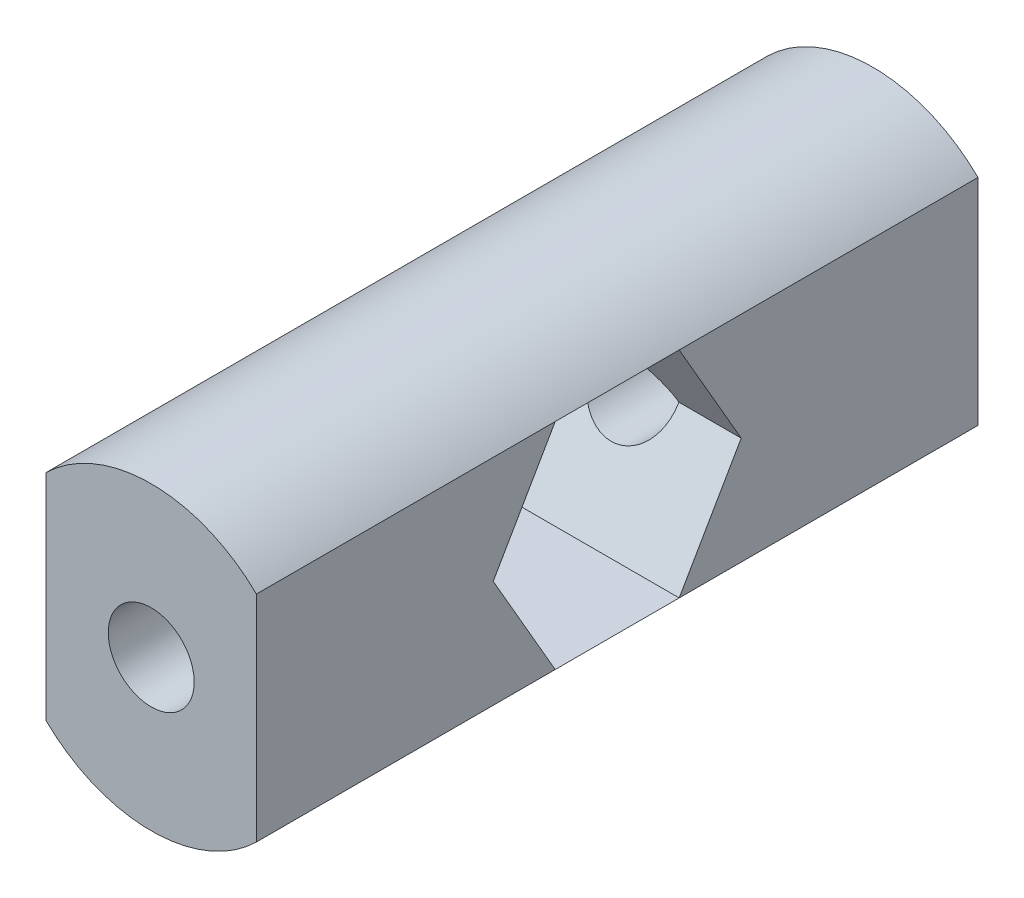
ISO-10303-21;
HEADER;
FILE_DESCRIPTION(('STEP AP214'),'2;1');
FILE_NAME('part.step','',(''),(''),'','','');
FILE_SCHEMA(('AUTOMOTIVE_DESIGN { 1 0 10303 214 1 1 1 1 }'));
ENDSEC;
DATA;
#1=APPLICATION_CONTEXT('core data for automotive mechanical design processes');
#2=APPLICATION_PROTOCOL_DEFINITION('international standard','automotive_design',2000,#1);
#3=PRODUCT_CONTEXT('',#1,'mechanical');
#4=PRODUCT('Part','Part','',(#3));
#5=PRODUCT_RELATED_PRODUCT_CATEGORY('part','',(#4));
#6=PRODUCT_DEFINITION_FORMATION('','',#4);
#7=PRODUCT_DEFINITION_CONTEXT('part definition',#1,'design');
#8=PRODUCT_DEFINITION('design','',#6,#7);
#9=PRODUCT_DEFINITION_SHAPE('','',#8);
#10=(LENGTH_UNIT() NAMED_UNIT(*) SI_UNIT(.MILLI.,.METRE.));
#11=(NAMED_UNIT(*) PLANE_ANGLE_UNIT() SI_UNIT($,.RADIAN.));
#12=(NAMED_UNIT(*) SI_UNIT($,.STERADIAN.) SOLID_ANGLE_UNIT());
#13=UNCERTAINTY_MEASURE_WITH_UNIT(LENGTH_MEASURE(1.E-05),#10,'distance_accuracy_value','');
#14=(GEOMETRIC_REPRESENTATION_CONTEXT(3) GLOBAL_UNCERTAINTY_ASSIGNED_CONTEXT((#13)) GLOBAL_UNIT_ASSIGNED_CONTEXT((#10,
#11,#12)) REPRESENTATION_CONTEXT('',''));
#15=CARTESIAN_POINT('',(0.,0.,0.));
#16=DIRECTION('',(0.,0.,1.));
#17=DIRECTION('',(1.,0.,0.));
#18=AXIS2_PLACEMENT_3D('',#15,#16,#17);
#19=CARTESIAN_POINT('',(12.2474487139159,12.5,-42.));
#20=DIRECTION('',(-1.,0.,0.));
#21=DIRECTION('',(0.,0.,1.));
#22=AXIS2_PLACEMENT_3D('',#19,#20,#21);
#23=PLANE('',#22);
#24=DIRECTION('',(0.,0.,1.));
#25=VECTOR('',#24,1.);
#26=CARTESIAN_POINT('',(12.2474487139159,-12.5,-42.));
#27=LINE('',#26,#25);
#28=CARTESIAN_POINT('',(12.2474487139159,-12.5,7.21687836487032));
#29=VERTEX_POINT('',#28);
#30=CARTESIAN_POINT('',(12.2474487139159,-12.5,42.));
#31=VERTEX_POINT('',#30);
#32=EDGE_CURVE('E165',#29,#31,#27,.T.);
#33=ORIENTED_EDGE('',*,*,#32,.F.);
#34=DIRECTION('',(0.,-0.866025403784439,-0.5));
#35=VECTOR('',#34,1.);
#36=CARTESIAN_POINT('',(12.2474487139159,0.,14.4337567297406));
#37=LINE('',#36,#35);
#38=CARTESIAN_POINT('',(12.2474487139159,0.,14.4337567297406));
#39=VERTEX_POINT('',#38);
#40=EDGE_CURVE('E253',#39,#29,#37,.T.);
#41=ORIENTED_EDGE('',*,*,#40,.F.);
#42=DIRECTION('',(0.,-0.866025403784439,0.5));
#43=VECTOR('',#42,1.);
#44=CARTESIAN_POINT('',(12.2474487139159,12.5,7.21687836487032));
#45=LINE('',#44,#43);
#46=CARTESIAN_POINT('',(12.2474487139159,12.5,7.21687836487032));
#47=VERTEX_POINT('',#46);
#48=EDGE_CURVE('E148',#47,#39,#45,.T.);
#49=ORIENTED_EDGE('',*,*,#48,.F.);
#50=DIRECTION('',(0.,0.,1.));
#51=VECTOR('',#50,1.);
#52=CARTESIAN_POINT('',(12.2474487139159,12.5,-42.));
#53=LINE('',#52,#51);
#54=CARTESIAN_POINT('',(12.2474487139159,12.5,42.));
#55=VERTEX_POINT('',#54);
#56=EDGE_CURVE('E147',#47,#55,#53,.T.);
#57=ORIENTED_EDGE('',*,*,#56,.T.);
#58=DIRECTION('',(0.,-1.,0.));
#59=VECTOR('',#58,1.);
#60=CARTESIAN_POINT('',(12.2474487139159,12.5,42.));
#61=LINE('',#60,#59);
#62=EDGE_CURVE('E161',#55,#31,#61,.T.);
#63=ORIENTED_EDGE('',*,*,#62,.T.);
#64=EDGE_LOOP('',(#33,#41,#49,#57,#63));
#65=FACE_BOUND('',#64,.T.);
#66=ADVANCED_FACE('F33',(#65),#23,.F.);
#67=CARTESIAN_POINT('',(-12.2474487139159,12.5,-42.));
#68=DIRECTION('',(1.,0.,0.));
#69=DIRECTION('',(0.,0.,-1.));
#70=AXIS2_PLACEMENT_3D('',#67,#68,#69);
#71=PLANE('',#70);
#72=DIRECTION('',(0.,-0.866025403784439,0.5));
#73=VECTOR('',#72,1.);
#74=CARTESIAN_POINT('',(-12.2474487139159,33.8115334794732,-5.08734122634725));
#75=LINE('',#74,#73);
#76=CARTESIAN_POINT('',(-12.2474487139159,12.5,7.21687836487032));
#77=VERTEX_POINT('',#76);
#78=CARTESIAN_POINT('',(-12.2474487139159,0.,14.4337567297406));
#79=VERTEX_POINT('',#78);
#80=EDGE_CURVE('E204',#77,#79,#75,.T.);
#81=ORIENTED_EDGE('',*,*,#80,.T.);
#82=DIRECTION('',(0.,-0.866025403784439,-0.5));
#83=VECTOR('',#82,1.);
#84=CARTESIAN_POINT('',(-12.2474487139159,-15.0615334794732,5.73797632095823));
#85=LINE('',#84,#83);
#86=CARTESIAN_POINT('',(-12.2474487139159,-12.5,7.21687836487032));
#87=VERTEX_POINT('',#86);
#88=EDGE_CURVE('E192',#79,#87,#85,.T.);
#89=ORIENTED_EDGE('',*,*,#88,.T.);
#90=DIRECTION('',(0.,0.,1.));
#91=VECTOR('',#90,1.);
#92=CARTESIAN_POINT('',(-12.2474487139159,-12.5,-42.));
#93=LINE('',#92,#91);
#94=CARTESIAN_POINT('',(-12.2474487139159,-12.5,42.));
#95=VERTEX_POINT('',#94);
#96=EDGE_CURVE('E227',#87,#95,#93,.T.);
#97=ORIENTED_EDGE('',*,*,#96,.T.);
#98=DIRECTION('',(0.,1.,0.));
#99=VECTOR('',#98,1.);
#100=CARTESIAN_POINT('',(-12.2474487139159,12.5,42.));
#101=LINE('',#100,#99);
#102=CARTESIAN_POINT('',(-12.2474487139159,12.5,42.));
#103=VERTEX_POINT('',#102);
#104=EDGE_CURVE('E214',#95,#103,#101,.T.);
#105=ORIENTED_EDGE('',*,*,#104,.T.);
#106=DIRECTION('',(0.,0.,1.));
#107=VECTOR('',#106,1.);
#108=CARTESIAN_POINT('',(-12.2474487139159,12.5,-42.));
#109=LINE('',#108,#107);
#110=EDGE_CURVE('E220',#77,#103,#109,.T.);
#111=ORIENTED_EDGE('',*,*,#110,.F.);
#112=EDGE_LOOP('',(#81,#89,#97,#105,#111));
#113=FACE_BOUND('',#112,.T.);
#114=ADVANCED_FACE('F245',(#113),#71,.F.);
#115=CARTESIAN_POINT('',(0.,0.,-42.));
#116=DIRECTION('',(0.,0.,1.));
#117=DIRECTION('',(1.,0.,0.));
#118=AXIS2_PLACEMENT_3D('',#115,#116,#117);
#119=CYLINDRICAL_SURFACE('',#118,5.);
#120=CARTESIAN_POINT('',(0.,0.,14.4337567297406));
#121=DIRECTION('',(0.,0.5,0.866025403784439));
#122=DIRECTION('',(0.,-0.866025403784439,0.5));
#123=AXIS2_PLACEMENT_3D('',#120,#121,#122);
#124=ELLIPSE('',#123,5.77350269189626,5.);
#125=CARTESIAN_POINT('',(-4.99999999999998,0.,14.4337567297406));
#126=VERTEX_POINT('',#125);
#127=CARTESIAN_POINT('',(5.00000000000002,0.,14.4337567297406));
#128=VERTEX_POINT('',#127);
#129=EDGE_CURVE('E41',#126,#128,#124,.F.);
#130=ORIENTED_EDGE('',*,*,#129,.T.);
#131=CARTESIAN_POINT('',(0.,0.,14.4337567297406));
#132=DIRECTION('',(0.,-0.5,0.866025403784439));
#133=DIRECTION('',(0.,0.866025403784439,0.5));
#134=AXIS2_PLACEMENT_3D('',#131,#132,#133);
#135=ELLIPSE('',#134,5.77350269189626,5.);
#136=EDGE_CURVE('E11',#128,#126,#135,.F.);
#137=ORIENTED_EDGE('',*,*,#136,.T.);
#138=EDGE_LOOP('',(#130,#137));
#139=FACE_BOUND('',#138,.T.);
#140=CARTESIAN_POINT('',(0.,0.,42.));
#141=DIRECTION('',(0.,0.,1.));
#142=DIRECTION('',(1.,0.,0.));
#143=AXIS2_PLACEMENT_3D('',#140,#141,#142);
#144=CIRCLE('',#143,5.);
#145=CARTESIAN_POINT('',(5.,0.,42.));
#146=VERTEX_POINT('',#145);
#147=EDGE_CURVE('E210',#146,#146,#144,.T.);
#148=ORIENTED_EDGE('',*,*,#147,.T.);
#149=EDGE_LOOP('',(#148));
#150=FACE_BOUND('',#149,.T.);
#151=ADVANCED_FACE('F177',(#139,#150),#119,.F.);
#152=CARTESIAN_POINT('',(0.,0.,42.));
#153=DIRECTION('',(0.,0.,-1.));
#154=DIRECTION('',(-1.,0.,0.));
#155=AXIS2_PLACEMENT_3D('',#152,#153,#154);
#156=CYLINDRICAL_SURFACE('',#155,17.5);
#157=CARTESIAN_POINT('',(0.,0.,42.));
#158=DIRECTION('',(0.,0.,1.));
#159=DIRECTION('',(1.,0.,0.));
#160=AXIS2_PLACEMENT_3D('',#157,#158,#159);
#161=CIRCLE('',#160,17.5);
#162=EDGE_CURVE('E169',#95,#31,#161,.T.);
#163=ORIENTED_EDGE('',*,*,#162,.F.);
#164=ORIENTED_EDGE('',*,*,#96,.F.);
#165=CARTESIAN_POINT('',(-12.2474487139159,-12.5,-7.21687836487032));
#166=VERTEX_POINT('',#165);
#167=EDGE_CURVE('E226',#166,#87,#93,.T.);
#168=ORIENTED_EDGE('',*,*,#167,.F.);
#169=CARTESIAN_POINT('',(-12.2474487139159,-12.5,-42.));
#170=VERTEX_POINT('',#169);
#171=EDGE_CURVE('E223',#170,#166,#93,.T.);
#172=ORIENTED_EDGE('',*,*,#171,.F.);
#173=CARTESIAN_POINT('',(0.,0.,-42.));
#174=DIRECTION('',(0.,0.,1.));
#175=DIRECTION('',(1.,0.,0.));
#176=AXIS2_PLACEMENT_3D('',#173,#174,#175);
#177=CIRCLE('',#176,17.5);
#178=CARTESIAN_POINT('',(12.2474487139159,-12.5,-42.));
#179=VERTEX_POINT('',#178);
#180=EDGE_CURVE('E154',#170,#179,#177,.T.);
#181=ORIENTED_EDGE('',*,*,#180,.T.);
#182=CARTESIAN_POINT('',(12.2474487139159,-12.5,-7.21687836487032));
#183=VERTEX_POINT('',#182);
#184=EDGE_CURVE('E158',#179,#183,#27,.T.);
#185=ORIENTED_EDGE('',*,*,#184,.T.);
#186=DIRECTION('',(0.,0.,-1.));
#187=VECTOR('',#186,1.);
#188=CARTESIAN_POINT('',(12.2474487139159,-12.5,7.21687836487032));
#189=LINE('',#188,#187);
#190=EDGE_CURVE('E201',#29,#183,#189,.T.);
#191=ORIENTED_EDGE('',*,*,#190,.F.);
#192=ORIENTED_EDGE('',*,*,#32,.T.);
#193=EDGE_LOOP('',(#163,#164,#168,#172,#181,#185,#191,#192));
#194=FACE_BOUND('',#193,.T.);
#195=ADVANCED_FACE('F248',(#194),#156,.T.);
#196=CARTESIAN_POINT('',(12.2474487139159,12.5,-42.));
#197=VERTEX_POINT('',#196);
#198=CARTESIAN_POINT('',(-12.2474487139159,12.5,-42.));
#199=VERTEX_POINT('',#198);
#200=EDGE_CURVE('E156',#197,#199,#177,.T.);
#201=ORIENTED_EDGE('',*,*,#200,.T.);
#202=CARTESIAN_POINT('',(-12.2474487139159,12.5,-7.21687836487032));
#203=VERTEX_POINT('',#202);
#204=EDGE_CURVE('E228',#199,#203,#109,.T.);
#205=ORIENTED_EDGE('',*,*,#204,.T.);
#206=EDGE_CURVE('E128',#203,#77,#109,.T.);
#207=ORIENTED_EDGE('',*,*,#206,.T.);
#208=ORIENTED_EDGE('',*,*,#110,.T.);
#209=EDGE_CURVE('E166',#55,#103,#161,.T.);
#210=ORIENTED_EDGE('',*,*,#209,.F.);
#211=ORIENTED_EDGE('',*,*,#56,.F.);
#212=DIRECTION('',(0.,0.,1.));
#213=VECTOR('',#212,1.);
#214=CARTESIAN_POINT('',(12.2474487139159,12.5,-7.21687836487032));
#215=LINE('',#214,#213);
#216=CARTESIAN_POINT('',(12.2474487139159,12.5,-7.21687836487032));
#217=VERTEX_POINT('',#216);
#218=EDGE_CURVE('E125',#217,#47,#215,.T.);
#219=ORIENTED_EDGE('',*,*,#218,.F.);
#220=EDGE_CURVE('E144',#197,#217,#53,.T.);
#221=ORIENTED_EDGE('',*,*,#220,.F.);
#222=EDGE_LOOP('',(#201,#205,#207,#208,#210,#211,#219,#221));
#223=FACE_BOUND('',#222,.T.);
#224=ADVANCED_FACE('F35',(#223),#156,.T.);
#225=CARTESIAN_POINT('',(0.,0.,42.));
#226=DIRECTION('',(0.,0.,1.));
#227=DIRECTION('',(1.,0.,0.));
#228=AXIS2_PLACEMENT_3D('',#225,#226,#227);
#229=PLANE('',#228);
#230=ORIENTED_EDGE('',*,*,#147,.F.);
#231=EDGE_LOOP('',(#230));
#232=FACE_BOUND('',#231,.T.);
#233=ORIENTED_EDGE('',*,*,#104,.F.);
#234=ORIENTED_EDGE('',*,*,#162,.T.);
#235=ORIENTED_EDGE('',*,*,#62,.F.);
#236=ORIENTED_EDGE('',*,*,#209,.T.);
#237=EDGE_LOOP('',(#233,#234,#235,#236));
#238=FACE_BOUND('',#237,.T.);
#239=ADVANCED_FACE('F241',(#232,#238),#229,.T.);
#240=CARTESIAN_POINT('',(0.,0.,-42.));
#241=DIRECTION('',(0.,0.,1.));
#242=DIRECTION('',(1.,0.,0.));
#243=AXIS2_PLACEMENT_3D('',#240,#241,#242);
#244=PLANE('',#243);
#245=CARTESIAN_POINT('',(0.,0.,-42.));
#246=DIRECTION('',(0.,0.,1.));
#247=DIRECTION('',(1.,0.,0.));
#248=AXIS2_PLACEMENT_3D('',#245,#246,#247);
#249=CIRCLE('',#248,5.);
#250=CARTESIAN_POINT('',(5.,0.,-42.));
#251=VERTEX_POINT('',#250);
#252=EDGE_CURVE('E211',#251,#251,#249,.T.);
#253=ORIENTED_EDGE('',*,*,#252,.T.);
#254=EDGE_LOOP('',(#253));
#255=FACE_BOUND('',#254,.T.);
#256=ORIENTED_EDGE('',*,*,#180,.F.);
#257=DIRECTION('',(0.,1.,0.));
#258=VECTOR('',#257,1.);
#259=CARTESIAN_POINT('',(-12.2474487139159,12.5,-42.));
#260=LINE('',#259,#258);
#261=EDGE_CURVE('E217',#170,#199,#260,.T.);
#262=ORIENTED_EDGE('',*,*,#261,.T.);
#263=ORIENTED_EDGE('',*,*,#200,.F.);
#264=DIRECTION('',(0.,-1.,0.));
#265=VECTOR('',#264,1.);
#266=CARTESIAN_POINT('',(12.2474487139159,12.5,-42.));
#267=LINE('',#266,#265);
#268=EDGE_CURVE('E153',#197,#179,#267,.T.);
#269=ORIENTED_EDGE('',*,*,#268,.T.);
#270=EDGE_LOOP('',(#256,#262,#263,#269));
#271=FACE_BOUND('',#270,.T.);
#272=ADVANCED_FACE('F264',(#255,#271),#244,.F.);
#273=DIRECTION('',(0.,0.866025403784438,0.5));
#274=VECTOR('',#273,1.);
#275=CARTESIAN_POINT('',(12.2474487139159,0.,-14.4337567297406));
#276=LINE('',#275,#274);
#277=CARTESIAN_POINT('',(12.2474487139159,0.,-14.4337567297406));
#278=VERTEX_POINT('',#277);
#279=EDGE_CURVE('E134',#278,#217,#276,.T.);
#280=ORIENTED_EDGE('',*,*,#279,.F.);
#281=DIRECTION('',(0.,0.866025403784439,-0.5));
#282=VECTOR('',#281,1.);
#283=CARTESIAN_POINT('',(12.2474487139159,-12.5,-7.21687836487032));
#284=LINE('',#283,#282);
#285=EDGE_CURVE('E48',#183,#278,#284,.T.);
#286=ORIENTED_EDGE('',*,*,#285,.F.);
#287=ORIENTED_EDGE('',*,*,#184,.F.);
#288=ORIENTED_EDGE('',*,*,#268,.F.);
#289=ORIENTED_EDGE('',*,*,#220,.T.);
#290=EDGE_LOOP('',(#280,#286,#287,#288,#289));
#291=FACE_BOUND('',#290,.T.);
#292=ADVANCED_FACE('F150',(#291),#23,.F.);
#293=ORIENTED_EDGE('',*,*,#171,.T.);
#294=DIRECTION('',(0.,0.866025403784439,-0.5));
#295=VECTOR('',#294,1.);
#296=CARTESIAN_POINT('',(-12.2474487139159,21.3115334794732,-26.7379763209582));
#297=LINE('',#296,#295);
#298=CARTESIAN_POINT('',(-12.2474487139159,0.,-14.4337567297406));
#299=VERTEX_POINT('',#298);
#300=EDGE_CURVE('E207',#166,#299,#297,.T.);
#301=ORIENTED_EDGE('',*,*,#300,.T.);
#302=DIRECTION('',(0.,0.866025403784439,0.5));
#303=VECTOR('',#302,1.);
#304=CARTESIAN_POINT('',(-12.2474487139159,-2.56153347947322,-15.9126587736527));
#305=LINE('',#304,#303);
#306=EDGE_CURVE('E202',#299,#203,#305,.T.);
#307=ORIENTED_EDGE('',*,*,#306,.T.);
#308=ORIENTED_EDGE('',*,*,#204,.F.);
#309=ORIENTED_EDGE('',*,*,#261,.F.);
#310=EDGE_LOOP('',(#293,#301,#307,#308,#309));
#311=FACE_BOUND('',#310,.T.);
#312=ADVANCED_FACE('F263',(#311),#71,.F.);
#313=CARTESIAN_POINT('',(0.,0.,-14.4337567297406));
#314=DIRECTION('',(0.,0.5,-0.866025403784438));
#315=DIRECTION('',(0.,0.866025403784439,0.5));
#316=AXIS2_PLACEMENT_3D('',#313,#314,#315);
#317=ELLIPSE('',#316,5.77350269189626,5.);
#318=CARTESIAN_POINT('',(4.99999999999998,0.,-14.4337567297406));
#319=VERTEX_POINT('',#318);
#320=CARTESIAN_POINT('',(-5.00000000000002,0.,-14.4337567297406));
#321=VERTEX_POINT('',#320);
#322=EDGE_CURVE('E168',#319,#321,#317,.F.);
#323=ORIENTED_EDGE('',*,*,#322,.T.);
#324=CARTESIAN_POINT('',(0.,0.,-14.4337567297406));
#325=DIRECTION('',(0.,-0.5,-0.866025403784439));
#326=DIRECTION('',(0.,-0.866025403784439,0.5));
#327=AXIS2_PLACEMENT_3D('',#324,#325,#326);
#328=ELLIPSE('',#327,5.77350269189626,5.);
#329=EDGE_CURVE('E173',#321,#319,#328,.F.);
#330=ORIENTED_EDGE('',*,*,#329,.T.);
#331=EDGE_LOOP('',(#323,#330));
#332=FACE_BOUND('',#331,.T.);
#333=ORIENTED_EDGE('',*,*,#252,.F.);
#334=EDGE_LOOP('',(#333));
#335=FACE_BOUND('',#334,.T.);
#336=ADVANCED_FACE('F282',(#332,#335),#119,.F.);
#337=CARTESIAN_POINT('',(-61.7525512860841,-12.5,7.21687836487032));
#338=DIRECTION('',(0.,-1.,0.));
#339=DIRECTION('',(0.,0.,-1.));
#340=AXIS2_PLACEMENT_3D('',#337,#338,#339);
#341=PLANE('',#340);
#342=DIRECTION('',(1.,0.,0.));
#343=VECTOR('',#342,1.);
#344=CARTESIAN_POINT('',(-61.7525512860841,-12.5,7.21687836487032));
#345=LINE('',#344,#343);
#346=EDGE_CURVE('E193',#87,#29,#345,.T.);
#347=ORIENTED_EDGE('',*,*,#346,.T.);
#348=ORIENTED_EDGE('',*,*,#190,.T.);
#349=DIRECTION('',(1.,0.,0.));
#350=VECTOR('',#349,1.);
#351=CARTESIAN_POINT('',(-61.7525512860841,-12.5,-7.21687836487032));
#352=LINE('',#351,#350);
#353=EDGE_CURVE('E195',#166,#183,#352,.T.);
#354=ORIENTED_EDGE('',*,*,#353,.F.);
#355=ORIENTED_EDGE('',*,*,#167,.T.);
#356=EDGE_LOOP('',(#347,#348,#354,#355));
#357=FACE_BOUND('',#356,.T.);
#358=ADVANCED_FACE('F260',(#357),#341,.F.);
#359=CARTESIAN_POINT('',(-61.7525512860841,12.5,-7.21687836487032));
#360=DIRECTION('',(0.,1.,0.));
#361=DIRECTION('',(0.,0.,1.));
#362=AXIS2_PLACEMENT_3D('',#359,#360,#361);
#363=PLANE('',#362);
#364=DIRECTION('',(1.,0.,0.));
#365=VECTOR('',#364,1.);
#366=CARTESIAN_POINT('',(-61.7525512860841,12.5,-7.21687836487032));
#367=LINE('',#366,#365);
#368=EDGE_CURVE('E56',#203,#217,#367,.T.);
#369=ORIENTED_EDGE('',*,*,#368,.T.);
#370=ORIENTED_EDGE('',*,*,#218,.T.);
#371=DIRECTION('',(1.,0.,0.));
#372=VECTOR('',#371,1.);
#373=CARTESIAN_POINT('',(-61.7525512860841,12.5,7.21687836487032));
#374=LINE('',#373,#372);
#375=EDGE_CURVE('E130',#77,#47,#374,.T.);
#376=ORIENTED_EDGE('',*,*,#375,.F.);
#377=ORIENTED_EDGE('',*,*,#206,.F.);
#378=EDGE_LOOP('',(#369,#370,#376,#377));
#379=FACE_BOUND('',#378,.T.);
#380=ADVANCED_FACE('F122',(#379),#363,.F.);
#381=CARTESIAN_POINT('',(-61.7525512860841,-12.5,-7.21687836487032));
#382=DIRECTION('',(0.,-0.5,-0.866025403784439));
#383=DIRECTION('',(0.,0.866025403784439,-0.5));
#384=AXIS2_PLACEMENT_3D('',#381,#382,#383);
#385=PLANE('',#384);
#386=ORIENTED_EDGE('',*,*,#353,.T.);
#387=ORIENTED_EDGE('',*,*,#285,.T.);
#388=DIRECTION('',(1.,0.,0.));
#389=VECTOR('',#388,1.);
#390=CARTESIAN_POINT('',(-61.7525512860841,0.,-14.4337567297406));
#391=LINE('',#390,#389);
#392=EDGE_CURVE('E136',#319,#278,#391,.T.);
#393=ORIENTED_EDGE('',*,*,#392,.F.);
#394=ORIENTED_EDGE('',*,*,#329,.F.);
#395=EDGE_CURVE('E131',#299,#321,#391,.T.);
#396=ORIENTED_EDGE('',*,*,#395,.F.);
#397=ORIENTED_EDGE('',*,*,#300,.F.);
#398=EDGE_LOOP('',(#386,#387,#393,#394,#396,#397));
#399=FACE_BOUND('',#398,.T.);
#400=ADVANCED_FACE('F258',(#399),#385,.F.);
#401=CARTESIAN_POINT('',(-61.7525512860841,0.,14.4337567297406));
#402=DIRECTION('',(0.,-0.5,0.866025403784439));
#403=DIRECTION('',(0.,-0.866025403784439,-0.5));
#404=AXIS2_PLACEMENT_3D('',#401,#402,#403);
#405=PLANE('',#404);
#406=DIRECTION('',(1.,0.,0.));
#407=VECTOR('',#406,1.);
#408=CARTESIAN_POINT('',(-61.7525512860841,0.,14.4337567297406));
#409=LINE('',#408,#407);
#410=EDGE_CURVE('E184',#79,#126,#409,.T.);
#411=ORIENTED_EDGE('',*,*,#410,.T.);
#412=ORIENTED_EDGE('',*,*,#136,.F.);
#413=EDGE_CURVE('E187',#128,#39,#409,.T.);
#414=ORIENTED_EDGE('',*,*,#413,.T.);
#415=ORIENTED_EDGE('',*,*,#40,.T.);
#416=ORIENTED_EDGE('',*,*,#346,.F.);
#417=ORIENTED_EDGE('',*,*,#88,.F.);
#418=EDGE_LOOP('',(#411,#412,#414,#415,#416,#417));
#419=FACE_BOUND('',#418,.T.);
#420=ADVANCED_FACE('F189',(#419),#405,.F.);
#421=CARTESIAN_POINT('',(-61.7525512860841,12.5,7.21687836487032));
#422=DIRECTION('',(0.,0.5,0.866025403784439));
#423=DIRECTION('',(0.,-0.866025403784439,0.5));
#424=AXIS2_PLACEMENT_3D('',#421,#422,#423);
#425=PLANE('',#424);
#426=ORIENTED_EDGE('',*,*,#375,.T.);
#427=ORIENTED_EDGE('',*,*,#48,.T.);
#428=ORIENTED_EDGE('',*,*,#413,.F.);
#429=ORIENTED_EDGE('',*,*,#129,.F.);
#430=ORIENTED_EDGE('',*,*,#410,.F.);
#431=ORIENTED_EDGE('',*,*,#80,.F.);
#432=EDGE_LOOP('',(#426,#427,#428,#429,#430,#431));
#433=FACE_BOUND('',#432,.T.);
#434=ADVANCED_FACE('F183',(#433),#425,.F.);
#435=CARTESIAN_POINT('',(-61.7525512860841,0.,-14.4337567297406));
#436=DIRECTION('',(0.,0.5,-0.866025403784438));
#437=DIRECTION('',(0.,0.866025403784439,0.5));
#438=AXIS2_PLACEMENT_3D('',#435,#436,#437);
#439=PLANE('',#438);
#440=ORIENTED_EDGE('',*,*,#395,.T.);
#441=ORIENTED_EDGE('',*,*,#322,.F.);
#442=ORIENTED_EDGE('',*,*,#392,.T.);
#443=ORIENTED_EDGE('',*,*,#279,.T.);
#444=ORIENTED_EDGE('',*,*,#368,.F.);
#445=ORIENTED_EDGE('',*,*,#306,.F.);
#446=EDGE_LOOP('',(#440,#441,#442,#443,#444,#445));
#447=FACE_BOUND('',#446,.T.);
#448=ADVANCED_FACE('F135',(#447),#439,.F.);
#449=CLOSED_SHELL('',(#66,#114,#151,#195,#224,#239,#272,#292,#312,#336,#358,#380,#400,#420,#434,#448));
#450=MANIFOLD_SOLID_BREP('B2',#449);
#451=ADVANCED_BREP_SHAPE_REPRESENTATION('',(#18,#450),#14);
#452=SHAPE_DEFINITION_REPRESENTATION(#9,#451);
ENDSEC;
END-ISO-10303-21;
